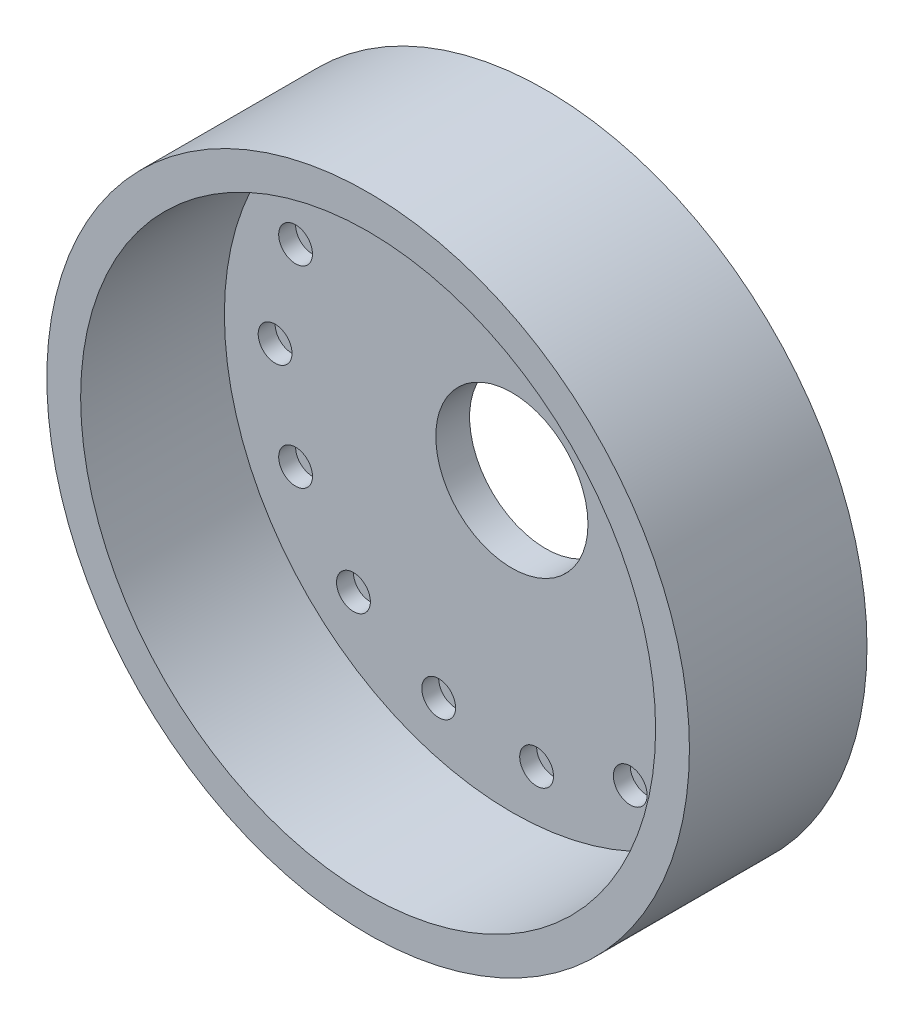
ISO-10303-21;
HEADER;
FILE_DESCRIPTION(('STEP AP214'),'2;1');
FILE_NAME('part.step','',(''),(''),'','','');
FILE_SCHEMA(('AUTOMOTIVE_DESIGN { 1 0 10303 214 1 1 1 1 }'));
ENDSEC;
DATA;
#1=APPLICATION_CONTEXT('core data for automotive mechanical design processes');
#2=APPLICATION_PROTOCOL_DEFINITION('international standard','automotive_design',2000,#1);
#3=PRODUCT_CONTEXT('',#1,'mechanical');
#4=PRODUCT('Part','Part','',(#3));
#5=PRODUCT_RELATED_PRODUCT_CATEGORY('part','',(#4));
#6=PRODUCT_DEFINITION_FORMATION('','',#4);
#7=PRODUCT_DEFINITION_CONTEXT('part definition',#1,'design');
#8=PRODUCT_DEFINITION('design','',#6,#7);
#9=PRODUCT_DEFINITION_SHAPE('','',#8);
#10=(LENGTH_UNIT() NAMED_UNIT(*) SI_UNIT(.MILLI.,.METRE.));
#11=(NAMED_UNIT(*) PLANE_ANGLE_UNIT() SI_UNIT($,.RADIAN.));
#12=(NAMED_UNIT(*) SI_UNIT($,.STERADIAN.) SOLID_ANGLE_UNIT());
#13=UNCERTAINTY_MEASURE_WITH_UNIT(LENGTH_MEASURE(1.E-05),#10,'distance_accuracy_value','');
#14=(GEOMETRIC_REPRESENTATION_CONTEXT(3) GLOBAL_UNCERTAINTY_ASSIGNED_CONTEXT((#13)) GLOBAL_UNIT_ASSIGNED_CONTEXT((#10,
#11,#12)) REPRESENTATION_CONTEXT('',''));
#15=CARTESIAN_POINT('',(0.,0.,0.));
#16=DIRECTION('',(0.,0.,1.));
#17=DIRECTION('',(1.,0.,0.));
#18=AXIS2_PLACEMENT_3D('',#15,#16,#17);
#19=CARTESIAN_POINT('',(0.,0.,33.3375));
#20=DIRECTION('',(0.,0.,-1.));
#21=DIRECTION('',(-1.,0.,0.));
#22=AXIS2_PLACEMENT_3D('',#19,#20,#21);
#23=CYLINDRICAL_SURFACE('',#22,60.325);
#24=CARTESIAN_POINT('',(0.,0.,33.3375));
#25=DIRECTION('',(0.,0.,1.));
#26=DIRECTION('',(1.,0.,0.));
#27=AXIS2_PLACEMENT_3D('',#24,#25,#26);
#28=CIRCLE('',#27,60.325);
#29=CARTESIAN_POINT('',(60.325,0.,33.3375));
#30=VERTEX_POINT('',#29);
#31=EDGE_CURVE('E11',#30,#30,#28,.T.);
#32=ORIENTED_EDGE('',*,*,#31,.F.);
#33=EDGE_LOOP('',(#32));
#34=FACE_BOUND('',#33,.T.);
#35=CARTESIAN_POINT('',(0.,0.,0.));
#36=DIRECTION('',(0.,0.,1.));
#37=DIRECTION('',(1.,0.,0.));
#38=AXIS2_PLACEMENT_3D('',#35,#36,#37);
#39=CIRCLE('',#38,60.325);
#40=CARTESIAN_POINT('',(60.325,0.,0.));
#41=VERTEX_POINT('',#40);
#42=EDGE_CURVE('E48',#41,#41,#39,.T.);
#43=ORIENTED_EDGE('',*,*,#42,.T.);
#44=EDGE_LOOP('',(#43));
#45=FACE_BOUND('',#44,.T.);
#46=ADVANCED_FACE('F45',(#34,#45),#23,.T.);
#47=CARTESIAN_POINT('',(0.,0.,33.3375));
#48=DIRECTION('',(0.,0.,1.));
#49=DIRECTION('',(1.,0.,0.));
#50=AXIS2_PLACEMENT_3D('',#47,#48,#49);
#51=PLANE('',#50);
#52=CARTESIAN_POINT('',(0.,0.,33.3375));
#53=DIRECTION('',(0.,0.,1.));
#54=DIRECTION('',(1.,0.,0.));
#55=AXIS2_PLACEMENT_3D('',#52,#53,#54);
#56=CIRCLE('',#55,53.975);
#57=CARTESIAN_POINT('',(53.975,0.,33.3375));
#58=VERTEX_POINT('',#57);
#59=EDGE_CURVE('E62',#58,#58,#56,.T.);
#60=ORIENTED_EDGE('',*,*,#59,.F.);
#61=EDGE_LOOP('',(#60));
#62=FACE_BOUND('',#61,.T.);
#63=ORIENTED_EDGE('',*,*,#31,.T.);
#64=EDGE_LOOP('',(#63));
#65=FACE_BOUND('',#64,.T.);
#66=ADVANCED_FACE('F248',(#62,#65),#51,.T.);
#67=CARTESIAN_POINT('',(0.,0.,0.));
#68=DIRECTION('',(0.,0.,1.));
#69=DIRECTION('',(1.,0.,0.));
#70=AXIS2_PLACEMENT_3D('',#67,#68,#69);
#71=PLANE('',#70);
#72=CARTESIAN_POINT('',(0.,0.,0.));
#73=DIRECTION('',(0.,0.,1.));
#74=DIRECTION('',(1.,0.,0.));
#75=AXIS2_PLACEMENT_3D('',#72,#73,#74);
#76=CIRCLE('',#75,14.2875);
#77=CARTESIAN_POINT('',(14.2875,0.,0.));
#78=VERTEX_POINT('',#77);
#79=EDGE_CURVE('E80',#78,#78,#76,.T.);
#80=ORIENTED_EDGE('',*,*,#79,.T.);
#81=EDGE_LOOP('',(#80));
#82=FACE_BOUND('',#81,.T.);
#83=ORIENTED_EDGE('',*,*,#42,.F.);
#84=EDGE_LOOP('',(#83));
#85=FACE_BOUND('',#84,.T.);
#86=ADVANCED_FACE('F195',(#82,#85),#71,.F.);
#87=CARTESIAN_POINT('',(0.,0.,-152.664354058176));
#88=DIRECTION('',(0.,0.,1.));
#89=DIRECTION('',(1.,0.,0.));
#90=AXIS2_PLACEMENT_3D('',#87,#88,#89);
#91=CYLINDRICAL_SURFACE('',#90,53.975);
#92=CARTESIAN_POINT('',(0.,0.,6.34999999999999));
#93=DIRECTION('',(0.,0.,1.));
#94=DIRECTION('',(1.,0.,0.));
#95=AXIS2_PLACEMENT_3D('',#92,#93,#94);
#96=CIRCLE('',#95,53.975);
#97=CARTESIAN_POINT('',(53.975,0.,6.34999999999997));
#98=VERTEX_POINT('',#97);
#99=EDGE_CURVE('E57',#98,#98,#96,.F.);
#100=CARTESIAN_POINT('',(53.975,0.,6.34999999999997));
#101=CARTESIAN_POINT('',(53.975,0.,6.63111979166663));
#102=CARTESIAN_POINT('',(53.975,0.,6.91223958333329));
#103=CARTESIAN_POINT('',(53.975,0.,7.47447916666663));
#104=CARTESIAN_POINT('',(53.975,0.,7.7555989583333));
#105=CARTESIAN_POINT('',(53.975,0.,8.31783854166664));
#106=CARTESIAN_POINT('',(53.975,0.,8.5989583333333));
#107=CARTESIAN_POINT('',(53.975,0.,9.16119791666664));
#108=CARTESIAN_POINT('',(53.975,0.,9.44231770833331));
#109=CARTESIAN_POINT('',(53.975,0.,10.0045572916667));
#110=CARTESIAN_POINT('',(53.975,0.,10.2856770833333));
#111=CARTESIAN_POINT('',(53.975,0.,10.8479166666666));
#112=CARTESIAN_POINT('',(53.975,0.,11.1290364583333));
#113=CARTESIAN_POINT('',(53.975,0.,11.6912760416666));
#114=CARTESIAN_POINT('',(53.975,0.,11.9723958333333));
#115=CARTESIAN_POINT('',(53.975,0.,12.5346354166667));
#116=CARTESIAN_POINT('',(53.975,0.,12.8157552083333));
#117=CARTESIAN_POINT('',(53.975,0.,13.3779947916666));
#118=CARTESIAN_POINT('',(53.975,0.,13.6591145833333));
#119=CARTESIAN_POINT('',(53.975,0.,14.2213541666666));
#120=CARTESIAN_POINT('',(53.975,0.,14.5024739583333));
#121=CARTESIAN_POINT('',(53.975,0.,15.0647135416667));
#122=CARTESIAN_POINT('',(53.975,0.,15.3458333333333));
#123=CARTESIAN_POINT('',(53.975,0.,15.9080729166666));
#124=CARTESIAN_POINT('',(53.975,0.,16.1891927083333));
#125=CARTESIAN_POINT('',(53.975,0.,16.7514322916666));
#126=CARTESIAN_POINT('',(53.975,0.,17.0325520833333));
#127=CARTESIAN_POINT('',(53.975,0.,17.5947916666667));
#128=CARTESIAN_POINT('',(53.975,0.,17.8759114583333));
#129=CARTESIAN_POINT('',(53.975,0.,18.4381510416667));
#130=CARTESIAN_POINT('',(53.975,0.,18.7192708333333));
#131=CARTESIAN_POINT('',(53.975,0.,19.2815104166667));
#132=CARTESIAN_POINT('',(53.975,0.,19.5626302083333));
#133=CARTESIAN_POINT('',(53.975,0.,20.1248697916667));
#134=CARTESIAN_POINT('',(53.975,0.,20.4059895833333));
#135=CARTESIAN_POINT('',(53.975,0.,20.9682291666667));
#136=CARTESIAN_POINT('',(53.975,0.,21.2493489583333));
#137=CARTESIAN_POINT('',(53.975,0.,21.8115885416667));
#138=CARTESIAN_POINT('',(53.975,0.,22.0927083333333));
#139=CARTESIAN_POINT('',(53.975,0.,22.6549479166667));
#140=CARTESIAN_POINT('',(53.975,0.,22.9360677083333));
#141=CARTESIAN_POINT('',(53.975,0.,23.4983072916667));
#142=CARTESIAN_POINT('',(53.975,0.,23.7794270833333));
#143=CARTESIAN_POINT('',(53.975,0.,24.3416666666667));
#144=CARTESIAN_POINT('',(53.975,0.,24.6227864583333));
#145=CARTESIAN_POINT('',(53.975,0.,25.1850260416667));
#146=CARTESIAN_POINT('',(53.975,0.,25.4661458333333));
#147=CARTESIAN_POINT('',(53.975,0.,26.0283854166667));
#148=CARTESIAN_POINT('',(53.975,0.,26.3095052083333));
#149=CARTESIAN_POINT('',(53.975,0.,26.8717447916667));
#150=CARTESIAN_POINT('',(53.975,0.,27.1528645833333));
#151=CARTESIAN_POINT('',(53.975,0.,27.7151041666667));
#152=CARTESIAN_POINT('',(53.975,0.,27.9962239583333));
#153=CARTESIAN_POINT('',(53.975,0.,28.5584635416667));
#154=CARTESIAN_POINT('',(53.975,0.,28.8395833333333));
#155=CARTESIAN_POINT('',(53.975,0.,29.4018229166667));
#156=CARTESIAN_POINT('',(53.975,0.,29.6829427083333));
#157=CARTESIAN_POINT('',(53.975,0.,30.2451822916667));
#158=CARTESIAN_POINT('',(53.975,0.,30.5263020833333));
#159=CARTESIAN_POINT('',(53.975,0.,31.0885416666667));
#160=CARTESIAN_POINT('',(53.975,0.,31.3696614583333));
#161=CARTESIAN_POINT('',(53.975,0.,31.9319010416667));
#162=CARTESIAN_POINT('',(53.975,0.,32.2130208333334));
#163=CARTESIAN_POINT('',(53.975,0.,32.7752604166667));
#164=CARTESIAN_POINT('',(53.975,0.,33.0563802083334));
#165=CARTESIAN_POINT('',(53.975,0.,33.3375));
#166=B_SPLINE_CURVE_WITH_KNOTS('',3,(#100,#101,#102,#103,#104,#105,#106,#107,#108,#109,#110,
#111,#112,#113,#114,#115,#116,#117,#118,#119,#120,#121,#122,#123,#124,#125,#126,#127,#128,#129,
#130,#131,#132,#133,#134,#135,#136,#137,#138,#139,#140,#141,#142,#143,#144,#145,#146,#147,#148,
#149,#150,#151,#152,#153,#154,#155,#156,#157,#158,#159,#160,#161,#162,#163,#164,#165),
.UNSPECIFIED.,.F.,.F.,(4,2,2,2,2,2,2,2,2,2,2,2,2,2,2,2,2,2,2,2,2,2,2,2,2,2,2,2,2,2,2,2,4),(0.,
0.843359374999991,1.68671875000001,2.530078125,3.37343750000002,4.21679687500001,5.06015625,
5.90351562500002,6.74687500000001,7.590234375,8.43359375000002,9.27695312500001,10.1203125,
10.963671875,11.80703125,12.650390625,13.49375,14.337109375,15.18046875,16.023828125,16.8671875,
17.710546875,18.55390625,19.397265625,20.240625,21.083984375,21.92734375,22.770703125,
23.6140625,24.4574218750001,25.30078125,26.1441406250001,26.9875000000001),.UNSPECIFIED.);
#167=EDGE_CURVE('BSEAM209',#98,#58,#166,.T.);
#168=ORIENTED_EDGE('',*,*,#99,.T.);
#169=ORIENTED_EDGE('',*,*,#59,.T.);
#170=ORIENTED_EDGE('',*,*,#167,.T.);
#171=ORIENTED_EDGE('',*,*,#167,.F.);
#172=EDGE_LOOP('',(#168,#170,#169,#171));
#173=FACE_BOUND('',#172,.T.);
#174=ADVANCED_FACE('F209',(#173),#91,.F.);
#175=CARTESIAN_POINT('',(0.,0.,6.35));
#176=DIRECTION('',(0.,0.,1.));
#177=DIRECTION('',(1.,0.,0.));
#178=AXIS2_PLACEMENT_3D('',#175,#176,#177);
#179=PLANE('',#178);
#180=CARTESIAN_POINT('',(0.,0.,6.35));
#181=DIRECTION('',(0.,0.,1.));
#182=DIRECTION('',(1.,0.,0.));
#183=AXIS2_PLACEMENT_3D('',#180,#181,#182);
#184=CIRCLE('',#183,14.2875);
#185=CARTESIAN_POINT('',(14.2875,0.,6.35));
#186=VERTEX_POINT('',#185);
#187=EDGE_CURVE('E187',#186,#186,#184,.T.);
#188=ORIENTED_EDGE('',*,*,#187,.F.);
#189=EDGE_LOOP('',(#188));
#190=FACE_BOUND('',#189,.T.);
#191=CARTESIAN_POINT('',(-40.6070955922136,-18.0794437847193,6.35));
#192=DIRECTION('',(0.,0.,1.));
#193=DIRECTION('',(1.,0.,0.));
#194=AXIS2_PLACEMENT_3D('',#191,#192,#193);
#195=CIRCLE('',#194,3.175);
#196=CARTESIAN_POINT('',(-37.4320955922136,-18.0794437847193,6.35));
#197=VERTEX_POINT('',#196);
#198=EDGE_CURVE('E79',#197,#197,#195,.T.);
#199=ORIENTED_EDGE('',*,*,#198,.F.);
#200=EDGE_LOOP('',(#199));
#201=FACE_BOUND('',#200,.T.);
#202=CARTESIAN_POINT('',(-29.7428554526512,-33.0327874924702,6.35));
#203=DIRECTION('',(0.,0.,1.));
#204=DIRECTION('',(1.,0.,0.));
#205=AXIS2_PLACEMENT_3D('',#202,#203,#204);
#206=CIRCLE('',#205,3.175);
#207=CARTESIAN_POINT('',(-26.5678554526512,-33.0327874924702,6.35));
#208=VERTEX_POINT('',#207);
#209=EDGE_CURVE('E88',#208,#208,#206,.T.);
#210=ORIENTED_EDGE('',*,*,#209,.F.);
#211=EDGE_LOOP('',(#210));
#212=FACE_BOUND('',#211,.T.);
#213=CARTESIAN_POINT('',(-13.7358053999663,-42.2744621493196,6.35));
#214=DIRECTION('',(0.,0.,1.));
#215=DIRECTION('',(1.,0.,0.));
#216=AXIS2_PLACEMENT_3D('',#213,#214,#215);
#217=CIRCLE('',#216,3.175);
#218=CARTESIAN_POINT('',(-10.5608053999663,-42.2744621493196,6.35));
#219=VERTEX_POINT('',#218);
#220=EDGE_CURVE('E96',#219,#219,#217,.T.);
#221=ORIENTED_EDGE('',*,*,#220,.F.);
#222=EDGE_LOOP('',(#221));
#223=FACE_BOUND('',#222,.T.);
#224=CARTESIAN_POINT('',(4.64629019224733,-44.2064982491198,6.35));
#225=DIRECTION('',(0.,0.,1.));
#226=DIRECTION('',(1.,0.,0.));
#227=AXIS2_PLACEMENT_3D('',#224,#225,#226);
#228=CIRCLE('',#227,3.175);
#229=CARTESIAN_POINT('',(7.82129019224733,-44.2064982491198,6.35));
#230=VERTEX_POINT('',#229);
#231=EDGE_CURVE('E104',#230,#230,#228,.T.);
#232=ORIENTED_EDGE('',*,*,#231,.F.);
#233=EDGE_LOOP('',(#232));
#234=FACE_BOUND('',#233,.T.);
#235=CARTESIAN_POINT('',(22.2250000000001,-38.4948291982183,6.35));
#236=DIRECTION('',(0.,0.,1.));
#237=DIRECTION('',(1.,0.,0.));
#238=AXIS2_PLACEMENT_3D('',#235,#236,#237);
#239=CIRCLE('',#238,3.175);
#240=CARTESIAN_POINT('',(25.4000000000001,-38.4948291982183,6.35));
#241=VERTEX_POINT('',#240);
#242=EDGE_CURVE('E112',#241,#241,#239,.T.);
#243=ORIENTED_EDGE('',*,*,#242,.F.);
#244=EDGE_LOOP('',(#243));
#245=FACE_BOUND('',#244,.T.);
#246=CARTESIAN_POINT('',(35.9608053999666,-26.1270544644005,6.35));
#247=DIRECTION('',(0.,0.,1.));
#248=DIRECTION('',(1.,0.,0.));
#249=AXIS2_PLACEMENT_3D('',#246,#247,#248);
#250=CIRCLE('',#249,3.175);
#251=CARTESIAN_POINT('',(39.1358053999666,-26.1270544644005,6.35));
#252=VERTEX_POINT('',#251);
#253=EDGE_CURVE('E120',#252,#252,#250,.T.);
#254=ORIENTED_EDGE('',*,*,#253,.F.);
#255=EDGE_LOOP('',(#254));
#256=FACE_BOUND('',#255,.T.);
#257=CARTESIAN_POINT('',(43.4786608526178,-9.24167465684938,6.35));
#258=DIRECTION('',(0.,0.,1.));
#259=DIRECTION('',(1.,0.,0.));
#260=AXIS2_PLACEMENT_3D('',#257,#258,#259);
#261=CIRCLE('',#260,3.175);
#262=CARTESIAN_POINT('',(46.6536608526178,-9.24167465684938,6.35));
#263=VERTEX_POINT('',#262);
#264=EDGE_CURVE('E128',#263,#263,#261,.T.);
#265=ORIENTED_EDGE('',*,*,#264,.F.);
#266=EDGE_LOOP('',(#265));
#267=FACE_BOUND('',#266,.T.);
#268=CARTESIAN_POINT('',(43.4786608526178,9.24167465684946,6.35));
#269=DIRECTION('',(0.,0.,1.));
#270=DIRECTION('',(1.,0.,0.));
#271=AXIS2_PLACEMENT_3D('',#268,#269,#270);
#272=CIRCLE('',#271,3.175);
#273=CARTESIAN_POINT('',(46.6536608526178,9.24167465684946,6.35));
#274=VERTEX_POINT('',#273);
#275=EDGE_CURVE('E136',#274,#274,#272,.T.);
#276=ORIENTED_EDGE('',*,*,#275,.F.);
#277=EDGE_LOOP('',(#276));
#278=FACE_BOUND('',#277,.T.);
#279=CARTESIAN_POINT('',(35.9608053999665,26.1270544644005,6.35));
#280=DIRECTION('',(0.,0.,1.));
#281=DIRECTION('',(1.,0.,0.));
#282=AXIS2_PLACEMENT_3D('',#279,#280,#281);
#283=CIRCLE('',#282,3.175);
#284=CARTESIAN_POINT('',(39.1358053999665,26.1270544644005,6.35));
#285=VERTEX_POINT('',#284);
#286=EDGE_CURVE('E144',#285,#285,#283,.T.);
#287=ORIENTED_EDGE('',*,*,#286,.F.);
#288=EDGE_LOOP('',(#287));
#289=FACE_BOUND('',#288,.T.);
#290=CARTESIAN_POINT('',(22.2250000000001,38.4948291982184,6.35));
#291=DIRECTION('',(0.,0.,1.));
#292=DIRECTION('',(1.,0.,0.));
#293=AXIS2_PLACEMENT_3D('',#290,#291,#292);
#294=CIRCLE('',#293,3.175);
#295=CARTESIAN_POINT('',(25.4000000000001,38.4948291982184,6.35));
#296=VERTEX_POINT('',#295);
#297=EDGE_CURVE('E152',#296,#296,#294,.T.);
#298=ORIENTED_EDGE('',*,*,#297,.F.);
#299=EDGE_LOOP('',(#298));
#300=FACE_BOUND('',#299,.T.);
#301=CARTESIAN_POINT('',(4.64629019224726,44.2064982491198,6.35));
#302=DIRECTION('',(0.,0.,1.));
#303=DIRECTION('',(1.,0.,0.));
#304=AXIS2_PLACEMENT_3D('',#301,#302,#303);
#305=CIRCLE('',#304,3.175);
#306=CARTESIAN_POINT('',(7.82129019224726,44.2064982491198,6.35));
#307=VERTEX_POINT('',#306);
#308=EDGE_CURVE('E160',#307,#307,#305,.T.);
#309=ORIENTED_EDGE('',*,*,#308,.F.);
#310=EDGE_LOOP('',(#309));
#311=FACE_BOUND('',#310,.T.);
#312=CARTESIAN_POINT('',(-13.7358053999664,42.2744621493197,6.35));
#313=DIRECTION('',(0.,0.,1.));
#314=DIRECTION('',(1.,0.,0.));
#315=AXIS2_PLACEMENT_3D('',#312,#313,#314);
#316=CIRCLE('',#315,3.175);
#317=CARTESIAN_POINT('',(-10.5608053999664,42.2744621493197,6.35));
#318=VERTEX_POINT('',#317);
#319=EDGE_CURVE('E168',#318,#318,#316,.T.);
#320=ORIENTED_EDGE('',*,*,#319,.F.);
#321=EDGE_LOOP('',(#320));
#322=FACE_BOUND('',#321,.T.);
#323=CARTESIAN_POINT('',(-29.7428554526512,33.0327874924702,6.35));
#324=DIRECTION('',(0.,0.,1.));
#325=DIRECTION('',(1.,0.,0.));
#326=AXIS2_PLACEMENT_3D('',#323,#324,#325);
#327=CIRCLE('',#326,3.17499999999999);
#328=CARTESIAN_POINT('',(-26.5678554526512,33.0327874924702,6.35));
#329=VERTEX_POINT('',#328);
#330=EDGE_CURVE('E176',#329,#329,#327,.T.);
#331=ORIENTED_EDGE('',*,*,#330,.F.);
#332=EDGE_LOOP('',(#331));
#333=FACE_BOUND('',#332,.T.);
#334=CARTESIAN_POINT('',(-40.6070955922136,18.0794437847194,6.35));
#335=DIRECTION('',(0.,0.,1.));
#336=DIRECTION('',(1.,0.,0.));
#337=AXIS2_PLACEMENT_3D('',#334,#335,#336);
#338=CIRCLE('',#337,3.175);
#339=CARTESIAN_POINT('',(-37.4320955922136,18.0794437847194,6.35));
#340=VERTEX_POINT('',#339);
#341=EDGE_CURVE('E71',#340,#340,#338,.T.);
#342=ORIENTED_EDGE('',*,*,#341,.F.);
#343=EDGE_LOOP('',(#342));
#344=FACE_BOUND('',#343,.T.);
#345=CARTESIAN_POINT('',(-44.45,0.,6.35));
#346=DIRECTION('',(0.,0.,1.));
#347=DIRECTION('',(1.,0.,0.));
#348=AXIS2_PLACEMENT_3D('',#345,#346,#347);
#349=CIRCLE('',#348,3.175);
#350=CARTESIAN_POINT('',(-41.275,0.,6.35));
#351=VERTEX_POINT('',#350);
#352=EDGE_CURVE('E67',#351,#351,#349,.T.);
#353=ORIENTED_EDGE('',*,*,#352,.F.);
#354=EDGE_LOOP('',(#353));
#355=FACE_BOUND('',#354,.T.);
#356=ORIENTED_EDGE('',*,*,#99,.F.);
#357=EDGE_LOOP('',(#356));
#358=FACE_BOUND('',#357,.T.);
#359=ADVANCED_FACE('F205',(#190,#201,#212,#223,#234,#245,#256,#267,#278,#289,#300,#311,#322,
#333,#344,#355,#358),#179,.T.);
#360=CARTESIAN_POINT('',(-44.45,0.,3.175));
#361=DIRECTION('',(0.,0.,1.));
#362=DIRECTION('',(1.,0.,0.));
#363=AXIS2_PLACEMENT_3D('',#360,#361,#362);
#364=CYLINDRICAL_SURFACE('',#363,3.175);
#365=CARTESIAN_POINT('',(-44.45,0.,3.175));
#366=DIRECTION('',(0.,0.,1.));
#367=DIRECTION('',(1.,0.,0.));
#368=AXIS2_PLACEMENT_3D('',#365,#366,#367);
#369=CIRCLE('',#368,3.175);
#370=CARTESIAN_POINT('',(-41.275,0.,3.175));
#371=VERTEX_POINT('',#370);
#372=EDGE_CURVE('E66',#371,#371,#369,.T.);
#373=ORIENTED_EDGE('',*,*,#372,.F.);
#374=EDGE_LOOP('',(#373));
#375=FACE_BOUND('',#374,.T.);
#376=ORIENTED_EDGE('',*,*,#352,.T.);
#377=EDGE_LOOP('',(#376));
#378=FACE_BOUND('',#377,.T.);
#379=ADVANCED_FACE('F208',(#375,#378),#364,.F.);
#380=CARTESIAN_POINT('',(-44.45,0.,3.175));
#381=DIRECTION('',(0.,0.,1.));
#382=DIRECTION('',(1.,0.,0.));
#383=AXIS2_PLACEMENT_3D('',#380,#381,#382);
#384=PLANE('',#383);
#385=ORIENTED_EDGE('',*,*,#372,.T.);
#386=EDGE_LOOP('',(#385));
#387=FACE_BOUND('',#386,.T.);
#388=ADVANCED_FACE('F259',(#387),#384,.T.);
#389=CARTESIAN_POINT('',(-40.6070955922136,18.0794437847194,3.175));
#390=DIRECTION('',(0.,0.,1.));
#391=DIRECTION('',(1.,0.,0.));
#392=AXIS2_PLACEMENT_3D('',#389,#390,#391);
#393=CYLINDRICAL_SURFACE('',#392,3.175);
#394=CARTESIAN_POINT('',(-40.6070955922136,18.0794437847194,3.175));
#395=DIRECTION('',(0.,0.,1.));
#396=DIRECTION('',(1.,0.,0.));
#397=AXIS2_PLACEMENT_3D('',#394,#395,#396);
#398=CIRCLE('',#397,3.175);
#399=CARTESIAN_POINT('',(-37.4320955922136,18.0794437847194,3.175));
#400=VERTEX_POINT('',#399);
#401=EDGE_CURVE('E180',#400,#400,#398,.T.);
#402=ORIENTED_EDGE('',*,*,#401,.F.);
#403=EDGE_LOOP('',(#402));
#404=FACE_BOUND('',#403,.T.);
#405=ORIENTED_EDGE('',*,*,#341,.T.);
#406=EDGE_LOOP('',(#405));
#407=FACE_BOUND('',#406,.T.);
#408=ADVANCED_FACE('F263',(#404,#407),#393,.F.);
#409=CARTESIAN_POINT('',(-40.6070955922136,18.0794437847194,3.175));
#410=DIRECTION('',(0.,0.,1.));
#411=DIRECTION('',(1.,0.,0.));
#412=AXIS2_PLACEMENT_3D('',#409,#410,#411);
#413=PLANE('',#412);
#414=ORIENTED_EDGE('',*,*,#401,.T.);
#415=EDGE_LOOP('',(#414));
#416=FACE_BOUND('',#415,.T.);
#417=ADVANCED_FACE('F367',(#416),#413,.T.);
#418=CARTESIAN_POINT('',(-29.7428554526512,33.0327874924702,3.175));
#419=DIRECTION('',(0.,0.,1.));
#420=DIRECTION('',(1.,0.,0.));
#421=AXIS2_PLACEMENT_3D('',#418,#419,#420);
#422=CYLINDRICAL_SURFACE('',#421,3.17499999999999);
#423=CARTESIAN_POINT('',(-29.7428554526512,33.0327874924702,3.175));
#424=DIRECTION('',(0.,0.,1.));
#425=DIRECTION('',(1.,0.,0.));
#426=AXIS2_PLACEMENT_3D('',#423,#424,#425);
#427=CIRCLE('',#426,3.17499999999999);
#428=CARTESIAN_POINT('',(-26.5678554526512,33.0327874924702,3.175));
#429=VERTEX_POINT('',#428);
#430=EDGE_CURVE('E172',#429,#429,#427,.T.);
#431=ORIENTED_EDGE('',*,*,#430,.F.);
#432=EDGE_LOOP('',(#431));
#433=FACE_BOUND('',#432,.T.);
#434=ORIENTED_EDGE('',*,*,#330,.T.);
#435=EDGE_LOOP('',(#434));
#436=FACE_BOUND('',#435,.T.);
#437=ADVANCED_FACE('F363',(#433,#436),#422,.F.);
#438=CARTESIAN_POINT('',(-29.7428554526512,33.0327874924702,3.175));
#439=DIRECTION('',(0.,0.,1.));
#440=DIRECTION('',(1.,0.,0.));
#441=AXIS2_PLACEMENT_3D('',#438,#439,#440);
#442=PLANE('',#441);
#443=ORIENTED_EDGE('',*,*,#430,.T.);
#444=EDGE_LOOP('',(#443));
#445=FACE_BOUND('',#444,.T.);
#446=ADVANCED_FACE('F359',(#445),#442,.T.);
#447=CARTESIAN_POINT('',(-13.7358053999664,42.2744621493197,3.175));
#448=DIRECTION('',(0.,0.,1.));
#449=DIRECTION('',(1.,0.,0.));
#450=AXIS2_PLACEMENT_3D('',#447,#448,#449);
#451=CYLINDRICAL_SURFACE('',#450,3.175);
#452=CARTESIAN_POINT('',(-13.7358053999664,42.2744621493197,3.175));
#453=DIRECTION('',(0.,0.,1.));
#454=DIRECTION('',(1.,0.,0.));
#455=AXIS2_PLACEMENT_3D('',#452,#453,#454);
#456=CIRCLE('',#455,3.175);
#457=CARTESIAN_POINT('',(-10.5608053999664,42.2744621493197,3.175));
#458=VERTEX_POINT('',#457);
#459=EDGE_CURVE('E164',#458,#458,#456,.T.);
#460=ORIENTED_EDGE('',*,*,#459,.F.);
#461=EDGE_LOOP('',(#460));
#462=FACE_BOUND('',#461,.T.);
#463=ORIENTED_EDGE('',*,*,#319,.T.);
#464=EDGE_LOOP('',(#463));
#465=FACE_BOUND('',#464,.T.);
#466=ADVANCED_FACE('F355',(#462,#465),#451,.F.);
#467=CARTESIAN_POINT('',(-13.7358053999664,42.2744621493197,3.175));
#468=DIRECTION('',(0.,0.,1.));
#469=DIRECTION('',(1.,0.,0.));
#470=AXIS2_PLACEMENT_3D('',#467,#468,#469);
#471=PLANE('',#470);
#472=ORIENTED_EDGE('',*,*,#459,.T.);
#473=EDGE_LOOP('',(#472));
#474=FACE_BOUND('',#473,.T.);
#475=ADVANCED_FACE('F351',(#474),#471,.T.);
#476=CARTESIAN_POINT('',(4.64629019224726,44.2064982491198,3.175));
#477=DIRECTION('',(0.,0.,1.));
#478=DIRECTION('',(1.,0.,0.));
#479=AXIS2_PLACEMENT_3D('',#476,#477,#478);
#480=CYLINDRICAL_SURFACE('',#479,3.175);
#481=CARTESIAN_POINT('',(4.64629019224726,44.2064982491198,3.175));
#482=DIRECTION('',(0.,0.,1.));
#483=DIRECTION('',(1.,0.,0.));
#484=AXIS2_PLACEMENT_3D('',#481,#482,#483);
#485=CIRCLE('',#484,3.175);
#486=CARTESIAN_POINT('',(7.82129019224726,44.2064982491198,3.175));
#487=VERTEX_POINT('',#486);
#488=EDGE_CURVE('E156',#487,#487,#485,.T.);
#489=ORIENTED_EDGE('',*,*,#488,.F.);
#490=EDGE_LOOP('',(#489));
#491=FACE_BOUND('',#490,.T.);
#492=ORIENTED_EDGE('',*,*,#308,.T.);
#493=EDGE_LOOP('',(#492));
#494=FACE_BOUND('',#493,.T.);
#495=ADVANCED_FACE('F347',(#491,#494),#480,.F.);
#496=CARTESIAN_POINT('',(4.64629019224726,44.2064982491198,3.175));
#497=DIRECTION('',(0.,0.,1.));
#498=DIRECTION('',(1.,0.,0.));
#499=AXIS2_PLACEMENT_3D('',#496,#497,#498);
#500=PLANE('',#499);
#501=ORIENTED_EDGE('',*,*,#488,.T.);
#502=EDGE_LOOP('',(#501));
#503=FACE_BOUND('',#502,.T.);
#504=ADVANCED_FACE('F343',(#503),#500,.T.);
#505=CARTESIAN_POINT('',(22.2250000000001,38.4948291982184,3.175));
#506=DIRECTION('',(0.,0.,1.));
#507=DIRECTION('',(1.,0.,0.));
#508=AXIS2_PLACEMENT_3D('',#505,#506,#507);
#509=CYLINDRICAL_SURFACE('',#508,3.175);
#510=CARTESIAN_POINT('',(22.2250000000001,38.4948291982184,3.175));
#511=DIRECTION('',(0.,0.,1.));
#512=DIRECTION('',(1.,0.,0.));
#513=AXIS2_PLACEMENT_3D('',#510,#511,#512);
#514=CIRCLE('',#513,3.175);
#515=CARTESIAN_POINT('',(25.4000000000001,38.4948291982184,3.175));
#516=VERTEX_POINT('',#515);
#517=EDGE_CURVE('E148',#516,#516,#514,.T.);
#518=ORIENTED_EDGE('',*,*,#517,.F.);
#519=EDGE_LOOP('',(#518));
#520=FACE_BOUND('',#519,.T.);
#521=ORIENTED_EDGE('',*,*,#297,.T.);
#522=EDGE_LOOP('',(#521));
#523=FACE_BOUND('',#522,.T.);
#524=ADVANCED_FACE('F339',(#520,#523),#509,.F.);
#525=CARTESIAN_POINT('',(22.2250000000001,38.4948291982184,3.175));
#526=DIRECTION('',(0.,0.,1.));
#527=DIRECTION('',(1.,0.,0.));
#528=AXIS2_PLACEMENT_3D('',#525,#526,#527);
#529=PLANE('',#528);
#530=ORIENTED_EDGE('',*,*,#517,.T.);
#531=EDGE_LOOP('',(#530));
#532=FACE_BOUND('',#531,.T.);
#533=ADVANCED_FACE('F335',(#532),#529,.T.);
#534=CARTESIAN_POINT('',(35.9608053999665,26.1270544644005,3.175));
#535=DIRECTION('',(0.,0.,1.));
#536=DIRECTION('',(1.,0.,0.));
#537=AXIS2_PLACEMENT_3D('',#534,#535,#536);
#538=CYLINDRICAL_SURFACE('',#537,3.175);
#539=CARTESIAN_POINT('',(35.9608053999665,26.1270544644005,3.175));
#540=DIRECTION('',(0.,0.,1.));
#541=DIRECTION('',(1.,0.,0.));
#542=AXIS2_PLACEMENT_3D('',#539,#540,#541);
#543=CIRCLE('',#542,3.175);
#544=CARTESIAN_POINT('',(39.1358053999665,26.1270544644005,3.175));
#545=VERTEX_POINT('',#544);
#546=EDGE_CURVE('E140',#545,#545,#543,.T.);
#547=ORIENTED_EDGE('',*,*,#546,.F.);
#548=EDGE_LOOP('',(#547));
#549=FACE_BOUND('',#548,.T.);
#550=ORIENTED_EDGE('',*,*,#286,.T.);
#551=EDGE_LOOP('',(#550));
#552=FACE_BOUND('',#551,.T.);
#553=ADVANCED_FACE('F331',(#549,#552),#538,.F.);
#554=CARTESIAN_POINT('',(35.9608053999665,26.1270544644005,3.175));
#555=DIRECTION('',(0.,0.,1.));
#556=DIRECTION('',(1.,0.,0.));
#557=AXIS2_PLACEMENT_3D('',#554,#555,#556);
#558=PLANE('',#557);
#559=ORIENTED_EDGE('',*,*,#546,.T.);
#560=EDGE_LOOP('',(#559));
#561=FACE_BOUND('',#560,.T.);
#562=ADVANCED_FACE('F327',(#561),#558,.T.);
#563=CARTESIAN_POINT('',(43.4786608526178,9.24167465684946,3.175));
#564=DIRECTION('',(0.,0.,1.));
#565=DIRECTION('',(1.,0.,0.));
#566=AXIS2_PLACEMENT_3D('',#563,#564,#565);
#567=CYLINDRICAL_SURFACE('',#566,3.175);
#568=CARTESIAN_POINT('',(43.4786608526178,9.24167465684946,3.175));
#569=DIRECTION('',(0.,0.,1.));
#570=DIRECTION('',(1.,0.,0.));
#571=AXIS2_PLACEMENT_3D('',#568,#569,#570);
#572=CIRCLE('',#571,3.175);
#573=CARTESIAN_POINT('',(46.6536608526178,9.24167465684946,3.175));
#574=VERTEX_POINT('',#573);
#575=EDGE_CURVE('E132',#574,#574,#572,.T.);
#576=ORIENTED_EDGE('',*,*,#575,.F.);
#577=EDGE_LOOP('',(#576));
#578=FACE_BOUND('',#577,.T.);
#579=ORIENTED_EDGE('',*,*,#275,.T.);
#580=EDGE_LOOP('',(#579));
#581=FACE_BOUND('',#580,.T.);
#582=ADVANCED_FACE('F323',(#578,#581),#567,.F.);
#583=CARTESIAN_POINT('',(43.4786608526178,9.24167465684946,3.175));
#584=DIRECTION('',(0.,0.,1.));
#585=DIRECTION('',(1.,0.,0.));
#586=AXIS2_PLACEMENT_3D('',#583,#584,#585);
#587=PLANE('',#586);
#588=ORIENTED_EDGE('',*,*,#575,.T.);
#589=EDGE_LOOP('',(#588));
#590=FACE_BOUND('',#589,.T.);
#591=ADVANCED_FACE('F319',(#590),#587,.T.);
#592=CARTESIAN_POINT('',(43.4786608526178,-9.24167465684938,3.175));
#593=DIRECTION('',(0.,0.,1.));
#594=DIRECTION('',(1.,0.,0.));
#595=AXIS2_PLACEMENT_3D('',#592,#593,#594);
#596=CYLINDRICAL_SURFACE('',#595,3.175);
#597=CARTESIAN_POINT('',(43.4786608526178,-9.24167465684938,3.175));
#598=DIRECTION('',(0.,0.,1.));
#599=DIRECTION('',(1.,0.,0.));
#600=AXIS2_PLACEMENT_3D('',#597,#598,#599);
#601=CIRCLE('',#600,3.175);
#602=CARTESIAN_POINT('',(46.6536608526178,-9.24167465684938,3.175));
#603=VERTEX_POINT('',#602);
#604=EDGE_CURVE('E124',#603,#603,#601,.T.);
#605=ORIENTED_EDGE('',*,*,#604,.F.);
#606=EDGE_LOOP('',(#605));
#607=FACE_BOUND('',#606,.T.);
#608=ORIENTED_EDGE('',*,*,#264,.T.);
#609=EDGE_LOOP('',(#608));
#610=FACE_BOUND('',#609,.T.);
#611=ADVANCED_FACE('F315',(#607,#610),#596,.F.);
#612=CARTESIAN_POINT('',(43.4786608526178,-9.24167465684938,3.175));
#613=DIRECTION('',(0.,0.,1.));
#614=DIRECTION('',(1.,0.,0.));
#615=AXIS2_PLACEMENT_3D('',#612,#613,#614);
#616=PLANE('',#615);
#617=ORIENTED_EDGE('',*,*,#604,.T.);
#618=EDGE_LOOP('',(#617));
#619=FACE_BOUND('',#618,.T.);
#620=ADVANCED_FACE('F311',(#619),#616,.T.);
#621=CARTESIAN_POINT('',(35.9608053999666,-26.1270544644005,3.175));
#622=DIRECTION('',(0.,0.,1.));
#623=DIRECTION('',(1.,0.,0.));
#624=AXIS2_PLACEMENT_3D('',#621,#622,#623);
#625=CYLINDRICAL_SURFACE('',#624,3.175);
#626=CARTESIAN_POINT('',(35.9608053999666,-26.1270544644005,3.175));
#627=DIRECTION('',(0.,0.,1.));
#628=DIRECTION('',(1.,0.,0.));
#629=AXIS2_PLACEMENT_3D('',#626,#627,#628);
#630=CIRCLE('',#629,3.175);
#631=CARTESIAN_POINT('',(39.1358053999666,-26.1270544644005,3.175));
#632=VERTEX_POINT('',#631);
#633=EDGE_CURVE('E116',#632,#632,#630,.T.);
#634=ORIENTED_EDGE('',*,*,#633,.F.);
#635=EDGE_LOOP('',(#634));
#636=FACE_BOUND('',#635,.T.);
#637=ORIENTED_EDGE('',*,*,#253,.T.);
#638=EDGE_LOOP('',(#637));
#639=FACE_BOUND('',#638,.T.);
#640=ADVANCED_FACE('F307',(#636,#639),#625,.F.);
#641=CARTESIAN_POINT('',(35.9608053999666,-26.1270544644005,3.175));
#642=DIRECTION('',(0.,0.,1.));
#643=DIRECTION('',(1.,0.,0.));
#644=AXIS2_PLACEMENT_3D('',#641,#642,#643);
#645=PLANE('',#644);
#646=ORIENTED_EDGE('',*,*,#633,.T.);
#647=EDGE_LOOP('',(#646));
#648=FACE_BOUND('',#647,.T.);
#649=ADVANCED_FACE('F303',(#648),#645,.T.);
#650=CARTESIAN_POINT('',(22.2250000000001,-38.4948291982183,3.175));
#651=DIRECTION('',(0.,0.,1.));
#652=DIRECTION('',(1.,0.,0.));
#653=AXIS2_PLACEMENT_3D('',#650,#651,#652);
#654=CYLINDRICAL_SURFACE('',#653,3.175);
#655=CARTESIAN_POINT('',(22.2250000000001,-38.4948291982183,3.175));
#656=DIRECTION('',(0.,0.,1.));
#657=DIRECTION('',(1.,0.,0.));
#658=AXIS2_PLACEMENT_3D('',#655,#656,#657);
#659=CIRCLE('',#658,3.175);
#660=CARTESIAN_POINT('',(25.4000000000001,-38.4948291982183,3.175));
#661=VERTEX_POINT('',#660);
#662=EDGE_CURVE('E108',#661,#661,#659,.T.);
#663=ORIENTED_EDGE('',*,*,#662,.F.);
#664=EDGE_LOOP('',(#663));
#665=FACE_BOUND('',#664,.T.);
#666=ORIENTED_EDGE('',*,*,#242,.T.);
#667=EDGE_LOOP('',(#666));
#668=FACE_BOUND('',#667,.T.);
#669=ADVANCED_FACE('F299',(#665,#668),#654,.F.);
#670=CARTESIAN_POINT('',(22.2250000000001,-38.4948291982183,3.175));
#671=DIRECTION('',(0.,0.,1.));
#672=DIRECTION('',(1.,0.,0.));
#673=AXIS2_PLACEMENT_3D('',#670,#671,#672);
#674=PLANE('',#673);
#675=ORIENTED_EDGE('',*,*,#662,.T.);
#676=EDGE_LOOP('',(#675));
#677=FACE_BOUND('',#676,.T.);
#678=ADVANCED_FACE('F295',(#677),#674,.T.);
#679=CARTESIAN_POINT('',(4.64629019224733,-44.2064982491198,3.175));
#680=DIRECTION('',(0.,0.,1.));
#681=DIRECTION('',(1.,0.,0.));
#682=AXIS2_PLACEMENT_3D('',#679,#680,#681);
#683=CYLINDRICAL_SURFACE('',#682,3.175);
#684=CARTESIAN_POINT('',(4.64629019224733,-44.2064982491198,3.175));
#685=DIRECTION('',(0.,0.,1.));
#686=DIRECTION('',(1.,0.,0.));
#687=AXIS2_PLACEMENT_3D('',#684,#685,#686);
#688=CIRCLE('',#687,3.175);
#689=CARTESIAN_POINT('',(7.82129019224733,-44.2064982491198,3.175));
#690=VERTEX_POINT('',#689);
#691=EDGE_CURVE('E100',#690,#690,#688,.T.);
#692=ORIENTED_EDGE('',*,*,#691,.F.);
#693=EDGE_LOOP('',(#692));
#694=FACE_BOUND('',#693,.T.);
#695=ORIENTED_EDGE('',*,*,#231,.T.);
#696=EDGE_LOOP('',(#695));
#697=FACE_BOUND('',#696,.T.);
#698=ADVANCED_FACE('F291',(#694,#697),#683,.F.);
#699=CARTESIAN_POINT('',(4.64629019224733,-44.2064982491198,3.175));
#700=DIRECTION('',(0.,0.,1.));
#701=DIRECTION('',(1.,0.,0.));
#702=AXIS2_PLACEMENT_3D('',#699,#700,#701);
#703=PLANE('',#702);
#704=ORIENTED_EDGE('',*,*,#691,.T.);
#705=EDGE_LOOP('',(#704));
#706=FACE_BOUND('',#705,.T.);
#707=ADVANCED_FACE('F287',(#706),#703,.T.);
#708=CARTESIAN_POINT('',(-13.7358053999663,-42.2744621493196,3.175));
#709=DIRECTION('',(0.,0.,1.));
#710=DIRECTION('',(1.,0.,0.));
#711=AXIS2_PLACEMENT_3D('',#708,#709,#710);
#712=CYLINDRICAL_SURFACE('',#711,3.175);
#713=CARTESIAN_POINT('',(-13.7358053999663,-42.2744621493196,3.175));
#714=DIRECTION('',(0.,0.,1.));
#715=DIRECTION('',(1.,0.,0.));
#716=AXIS2_PLACEMENT_3D('',#713,#714,#715);
#717=CIRCLE('',#716,3.175);
#718=CARTESIAN_POINT('',(-10.5608053999663,-42.2744621493196,3.175));
#719=VERTEX_POINT('',#718);
#720=EDGE_CURVE('E92',#719,#719,#717,.T.);
#721=ORIENTED_EDGE('',*,*,#720,.F.);
#722=EDGE_LOOP('',(#721));
#723=FACE_BOUND('',#722,.T.);
#724=ORIENTED_EDGE('',*,*,#220,.T.);
#725=EDGE_LOOP('',(#724));
#726=FACE_BOUND('',#725,.T.);
#727=ADVANCED_FACE('F283',(#723,#726),#712,.F.);
#728=CARTESIAN_POINT('',(-13.7358053999663,-42.2744621493196,3.175));
#729=DIRECTION('',(0.,0.,1.));
#730=DIRECTION('',(1.,0.,0.));
#731=AXIS2_PLACEMENT_3D('',#728,#729,#730);
#732=PLANE('',#731);
#733=ORIENTED_EDGE('',*,*,#720,.T.);
#734=EDGE_LOOP('',(#733));
#735=FACE_BOUND('',#734,.T.);
#736=ADVANCED_FACE('F279',(#735),#732,.T.);
#737=CARTESIAN_POINT('',(-29.7428554526512,-33.0327874924702,3.175));
#738=DIRECTION('',(0.,0.,1.));
#739=DIRECTION('',(1.,0.,0.));
#740=AXIS2_PLACEMENT_3D('',#737,#738,#739);
#741=CYLINDRICAL_SURFACE('',#740,3.175);
#742=CARTESIAN_POINT('',(-29.7428554526512,-33.0327874924702,3.175));
#743=DIRECTION('',(0.,0.,1.));
#744=DIRECTION('',(1.,0.,0.));
#745=AXIS2_PLACEMENT_3D('',#742,#743,#744);
#746=CIRCLE('',#745,3.175);
#747=CARTESIAN_POINT('',(-26.5678554526512,-33.0327874924702,3.175));
#748=VERTEX_POINT('',#747);
#749=EDGE_CURVE('E84',#748,#748,#746,.T.);
#750=ORIENTED_EDGE('',*,*,#749,.F.);
#751=EDGE_LOOP('',(#750));
#752=FACE_BOUND('',#751,.T.);
#753=ORIENTED_EDGE('',*,*,#209,.T.);
#754=EDGE_LOOP('',(#753));
#755=FACE_BOUND('',#754,.T.);
#756=ADVANCED_FACE('F275',(#752,#755),#741,.F.);
#757=CARTESIAN_POINT('',(-29.7428554526512,-33.0327874924702,3.175));
#758=DIRECTION('',(0.,0.,1.));
#759=DIRECTION('',(1.,0.,0.));
#760=AXIS2_PLACEMENT_3D('',#757,#758,#759);
#761=PLANE('',#760);
#762=ORIENTED_EDGE('',*,*,#749,.T.);
#763=EDGE_LOOP('',(#762));
#764=FACE_BOUND('',#763,.T.);
#765=ADVANCED_FACE('F271',(#764),#761,.T.);
#766=CARTESIAN_POINT('',(-40.6070955922136,-18.0794437847193,3.175));
#767=DIRECTION('',(0.,0.,1.));
#768=DIRECTION('',(1.,0.,0.));
#769=AXIS2_PLACEMENT_3D('',#766,#767,#768);
#770=CYLINDRICAL_SURFACE('',#769,3.175);
#771=CARTESIAN_POINT('',(-40.6070955922136,-18.0794437847193,3.175));
#772=DIRECTION('',(0.,0.,1.));
#773=DIRECTION('',(1.,0.,0.));
#774=AXIS2_PLACEMENT_3D('',#771,#772,#773);
#775=CIRCLE('',#774,3.175);
#776=CARTESIAN_POINT('',(-37.4320955922136,-18.0794437847193,3.175));
#777=VERTEX_POINT('',#776);
#778=EDGE_CURVE('E75',#777,#777,#775,.T.);
#779=ORIENTED_EDGE('',*,*,#778,.F.);
#780=EDGE_LOOP('',(#779));
#781=FACE_BOUND('',#780,.T.);
#782=ORIENTED_EDGE('',*,*,#198,.T.);
#783=EDGE_LOOP('',(#782));
#784=FACE_BOUND('',#783,.T.);
#785=ADVANCED_FACE('F267',(#781,#784),#770,.F.);
#786=CARTESIAN_POINT('',(-40.6070955922136,-18.0794437847193,3.175));
#787=DIRECTION('',(0.,0.,1.));
#788=DIRECTION('',(1.,0.,0.));
#789=AXIS2_PLACEMENT_3D('',#786,#787,#788);
#790=PLANE('',#789);
#791=ORIENTED_EDGE('',*,*,#778,.T.);
#792=EDGE_LOOP('',(#791));
#793=FACE_BOUND('',#792,.T.);
#794=ADVANCED_FACE('F201',(#793),#790,.T.);
#795=CARTESIAN_POINT('',(0.,0.,0.));
#796=DIRECTION('',(0.,0.,1.));
#797=DIRECTION('',(1.,0.,0.));
#798=AXIS2_PLACEMENT_3D('',#795,#796,#797);
#799=CYLINDRICAL_SURFACE('',#798,14.2875);
#800=ORIENTED_EDGE('',*,*,#79,.F.);
#801=EDGE_LOOP('',(#800));
#802=FACE_BOUND('',#801,.T.);
#803=ORIENTED_EDGE('',*,*,#187,.T.);
#804=EDGE_LOOP('',(#803));
#805=FACE_BOUND('',#804,.T.);
#806=ADVANCED_FACE('F198',(#802,#805),#799,.F.);
#807=CLOSED_SHELL('',(#46,#66,#86,#174,#359,#379,#388,#408,#417,#437,#446,#466,#475,#495,#504,
#524,#533,#553,#562,#582,#591,#611,#620,#640,#649,#669,#678,#698,#707,#727,#736,#756,#765,#785,
#794,#806));
#808=MANIFOLD_SOLID_BREP('B2',#807);
#809=ADVANCED_BREP_SHAPE_REPRESENTATION('',(#18,#808),#14);
#810=SHAPE_DEFINITION_REPRESENTATION(#9,#809);
ENDSEC;
END-ISO-10303-21;
